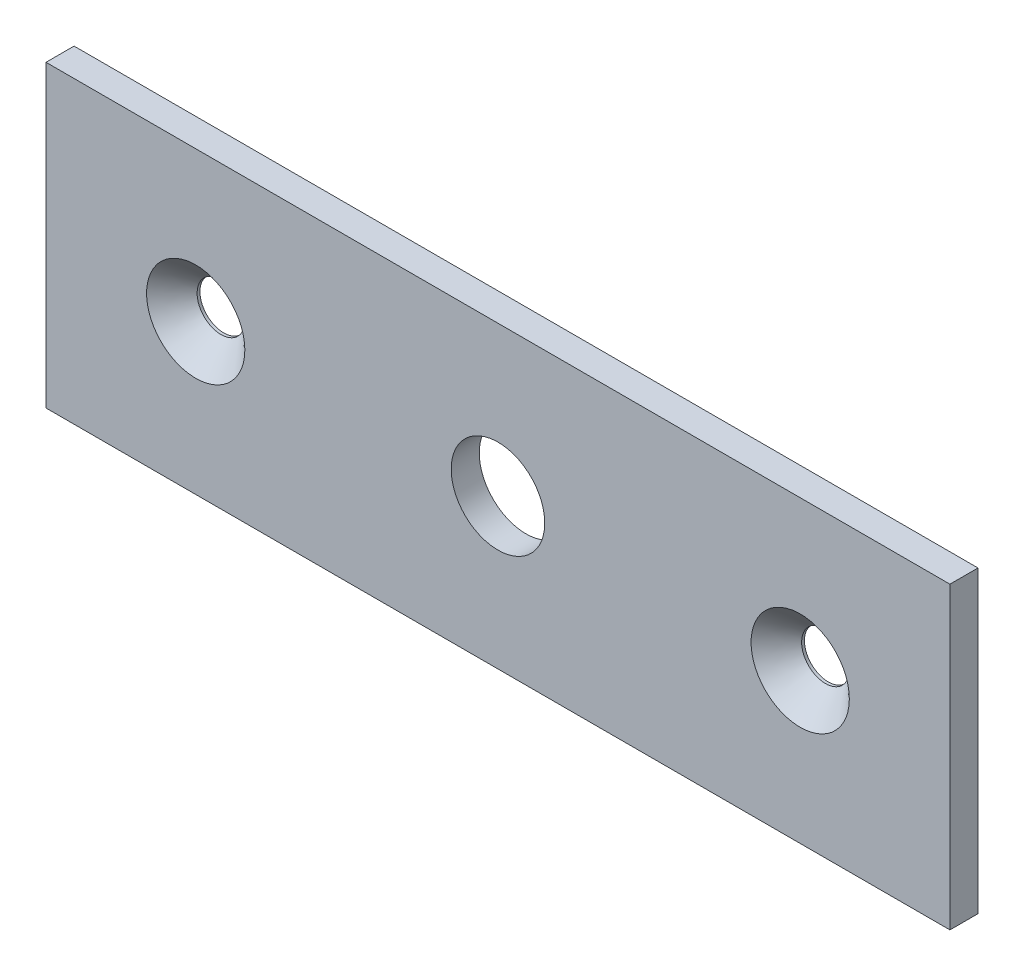
ISO-10303-21;
HEADER;
FILE_DESCRIPTION(('STEP AP214'),'2;1');
FILE_NAME('part.step','',(''),(''),'','','');
FILE_SCHEMA(('AUTOMOTIVE_DESIGN { 1 0 10303 214 1 1 1 1 }'));
ENDSEC;
DATA;
#1=APPLICATION_CONTEXT('core data for automotive mechanical design processes');
#2=APPLICATION_PROTOCOL_DEFINITION('international standard','automotive_design',2000,#1);
#3=PRODUCT_CONTEXT('',#1,'mechanical');
#4=PRODUCT('Part','Part','',(#3));
#5=PRODUCT_RELATED_PRODUCT_CATEGORY('part','',(#4));
#6=PRODUCT_DEFINITION_FORMATION('','',#4);
#7=PRODUCT_DEFINITION_CONTEXT('part definition',#1,'design');
#8=PRODUCT_DEFINITION('design','',#6,#7);
#9=PRODUCT_DEFINITION_SHAPE('','',#8);
#10=(LENGTH_UNIT() NAMED_UNIT(*) SI_UNIT(.MILLI.,.METRE.));
#11=(NAMED_UNIT(*) PLANE_ANGLE_UNIT() SI_UNIT($,.RADIAN.));
#12=(NAMED_UNIT(*) SI_UNIT($,.STERADIAN.) SOLID_ANGLE_UNIT());
#13=UNCERTAINTY_MEASURE_WITH_UNIT(LENGTH_MEASURE(1.E-05),#10,'distance_accuracy_value','');
#14=(GEOMETRIC_REPRESENTATION_CONTEXT(3) GLOBAL_UNCERTAINTY_ASSIGNED_CONTEXT((#13)) GLOBAL_UNIT_ASSIGNED_CONTEXT((#10,
#11,#12)) REPRESENTATION_CONTEXT('',''));
#15=CARTESIAN_POINT('',(0.,0.,0.));
#16=DIRECTION('',(0.,0.,1.));
#17=DIRECTION('',(1.,0.,0.));
#18=AXIS2_PLACEMENT_3D('',#15,#16,#17);
#19=CARTESIAN_POINT('',(-19.8824614450658,16.6713286713287,3.));
#20=DIRECTION('',(1.,0.,0.));
#21=DIRECTION('',(0.,0.,-1.));
#22=AXIS2_PLACEMENT_3D('',#19,#20,#21);
#23=PLANE('',#22);
#24=DIRECTION('',(0.,-1.,0.));
#25=VECTOR('',#24,1.);
#26=CARTESIAN_POINT('',(-19.8824614450658,16.6713286713287,0.));
#27=LINE('',#26,#25);
#28=CARTESIAN_POINT('',(-19.8824614450658,16.6713286713287,0.));
#29=VERTEX_POINT('',#28);
#30=CARTESIAN_POINT('',(-19.8824614450658,-15.3286713286713,0.));
#31=VERTEX_POINT('',#30);
#32=EDGE_CURVE('E102',#29,#31,#27,.T.);
#33=ORIENTED_EDGE('',*,*,#32,.T.);
#34=DIRECTION('',(0.,0.,-1.));
#35=VECTOR('',#34,1.);
#36=CARTESIAN_POINT('',(-19.8824614450658,-15.3286713286713,3.));
#37=LINE('',#36,#35);
#38=CARTESIAN_POINT('',(-19.8824614450658,-15.3286713286713,3.));
#39=VERTEX_POINT('',#38);
#40=EDGE_CURVE('E11',#39,#31,#37,.T.);
#41=ORIENTED_EDGE('',*,*,#40,.F.);
#42=DIRECTION('',(0.,-1.,0.));
#43=VECTOR('',#42,1.);
#44=CARTESIAN_POINT('',(-19.8824614450658,16.6713286713287,3.));
#45=LINE('',#44,#43);
#46=CARTESIAN_POINT('',(-19.8824614450658,16.6713286713287,3.));
#47=VERTEX_POINT('',#46);
#48=EDGE_CURVE('E90',#47,#39,#45,.T.);
#49=ORIENTED_EDGE('',*,*,#48,.F.);
#50=DIRECTION('',(0.,0.,-1.));
#51=VECTOR('',#50,1.);
#52=CARTESIAN_POINT('',(-19.8824614450658,16.6713286713287,3.));
#53=LINE('',#52,#51);
#54=EDGE_CURVE('E98',#47,#29,#53,.T.);
#55=ORIENTED_EDGE('',*,*,#54,.T.);
#56=EDGE_LOOP('',(#33,#41,#49,#55));
#57=FACE_BOUND('',#56,.T.);
#58=ADVANCED_FACE('F39',(#57),#23,.F.);
#59=CARTESIAN_POINT('',(-19.8824614450658,-15.3286713286713,3.));
#60=DIRECTION('',(0.,1.,0.));
#61=DIRECTION('',(-1.,0.,0.));
#62=AXIS2_PLACEMENT_3D('',#59,#60,#61);
#63=PLANE('',#62);
#64=DIRECTION('',(1.,0.,0.));
#65=VECTOR('',#64,1.);
#66=CARTESIAN_POINT('',(-19.8824614450658,-15.3286713286713,0.));
#67=LINE('',#66,#65);
#68=CARTESIAN_POINT('',(76.7175385549342,-15.3286713286713,0.));
#69=VERTEX_POINT('',#68);
#70=EDGE_CURVE('E94',#31,#69,#67,.T.);
#71=ORIENTED_EDGE('',*,*,#70,.T.);
#72=DIRECTION('',(0.,0.,-1.));
#73=VECTOR('',#72,1.);
#74=CARTESIAN_POINT('',(76.7175385549342,-15.3286713286713,3.));
#75=LINE('',#74,#73);
#76=CARTESIAN_POINT('',(76.7175385549342,-15.3286713286713,3.));
#77=VERTEX_POINT('',#76);
#78=EDGE_CURVE('E47',#77,#69,#75,.T.);
#79=ORIENTED_EDGE('',*,*,#78,.F.);
#80=DIRECTION('',(1.,0.,0.));
#81=VECTOR('',#80,1.);
#82=CARTESIAN_POINT('',(-19.8824614450658,-15.3286713286713,3.));
#83=LINE('',#82,#81);
#84=EDGE_CURVE('E85',#39,#77,#83,.T.);
#85=ORIENTED_EDGE('',*,*,#84,.F.);
#86=ORIENTED_EDGE('',*,*,#40,.T.);
#87=EDGE_LOOP('',(#71,#79,#85,#86));
#88=FACE_BOUND('',#87,.T.);
#89=ADVANCED_FACE('F93',(#88),#63,.F.);
#90=CARTESIAN_POINT('',(76.7175385549342,16.6713286713287,3.));
#91=DIRECTION('',(-1.,0.,0.));
#92=DIRECTION('',(0.,0.,1.));
#93=AXIS2_PLACEMENT_3D('',#90,#91,#92);
#94=PLANE('',#93);
#95=DIRECTION('',(0.,1.,0.));
#96=VECTOR('',#95,1.);
#97=CARTESIAN_POINT('',(76.7175385549342,16.6713286713287,0.));
#98=LINE('',#97,#96);
#99=CARTESIAN_POINT('',(76.7175385549342,16.6713286713287,0.));
#100=VERTEX_POINT('',#99);
#101=EDGE_CURVE('E72',#69,#100,#98,.T.);
#102=ORIENTED_EDGE('',*,*,#101,.T.);
#103=DIRECTION('',(0.,0.,-1.));
#104=VECTOR('',#103,1.);
#105=CARTESIAN_POINT('',(76.7175385549342,16.6713286713287,3.));
#106=LINE('',#105,#104);
#107=CARTESIAN_POINT('',(76.7175385549342,16.6713286713287,3.));
#108=VERTEX_POINT('',#107);
#109=EDGE_CURVE('E95',#108,#100,#106,.T.);
#110=ORIENTED_EDGE('',*,*,#109,.F.);
#111=DIRECTION('',(0.,1.,0.));
#112=VECTOR('',#111,1.);
#113=CARTESIAN_POINT('',(76.7175385549342,16.6713286713287,3.));
#114=LINE('',#113,#112);
#115=EDGE_CURVE('E88',#77,#108,#114,.T.);
#116=ORIENTED_EDGE('',*,*,#115,.F.);
#117=ORIENTED_EDGE('',*,*,#78,.T.);
#118=EDGE_LOOP('',(#102,#110,#116,#117));
#119=FACE_BOUND('',#118,.T.);
#120=ADVANCED_FACE('F96',(#119),#94,.F.);
#121=CARTESIAN_POINT('',(-19.8824614450658,16.6713286713287,3.));
#122=DIRECTION('',(0.,-1.,0.));
#123=DIRECTION('',(0.,0.,-1.));
#124=AXIS2_PLACEMENT_3D('',#121,#122,#123);
#125=PLANE('',#124);
#126=DIRECTION('',(-1.,0.,0.));
#127=VECTOR('',#126,1.);
#128=CARTESIAN_POINT('',(-19.8824614450658,16.6713286713287,0.));
#129=LINE('',#128,#127);
#130=EDGE_CURVE('E78',#100,#29,#129,.T.);
#131=ORIENTED_EDGE('',*,*,#130,.T.);
#132=ORIENTED_EDGE('',*,*,#54,.F.);
#133=DIRECTION('',(-1.,0.,0.));
#134=VECTOR('',#133,1.);
#135=CARTESIAN_POINT('',(-19.8824614450658,16.6713286713287,3.));
#136=LINE('',#135,#134);
#137=EDGE_CURVE('E55',#108,#47,#136,.T.);
#138=ORIENTED_EDGE('',*,*,#137,.F.);
#139=ORIENTED_EDGE('',*,*,#109,.T.);
#140=EDGE_LOOP('',(#131,#132,#138,#139));
#141=FACE_BOUND('',#140,.T.);
#142=ADVANCED_FACE('F110',(#141),#125,.F.);
#143=CARTESIAN_POINT('',(0.,0.,3.));
#144=DIRECTION('',(0.,0.,1.));
#145=DIRECTION('',(1.,0.,0.));
#146=AXIS2_PLACEMENT_3D('',#143,#144,#145);
#147=PLANE('',#146);
#148=CARTESIAN_POINT('',(-3.88246144506579,0.671328671328672,3.));
#149=DIRECTION('',(0.,0.,1.));
#150=DIRECTION('',(1.,0.,0.));
#151=AXIS2_PLACEMENT_3D('',#148,#149,#150);
#152=CIRCLE('',#151,5.250000041);
#153=CARTESIAN_POINT('',(1.36753859593421,0.671328671328672,3.));
#154=VERTEX_POINT('',#153);
#155=EDGE_CURVE('E136',#154,#154,#152,.T.);
#156=ORIENTED_EDGE('',*,*,#155,.F.);
#157=EDGE_LOOP('',(#156));
#158=FACE_BOUND('',#157,.T.);
#159=CARTESIAN_POINT('',(60.7175385549342,0.671328671328672,3.));
#160=DIRECTION('',(0.,0.,1.));
#161=DIRECTION('',(1.,0.,0.));
#162=AXIS2_PLACEMENT_3D('',#159,#160,#161);
#163=CIRCLE('',#162,5.250000041);
#164=CARTESIAN_POINT('',(65.9675385959342,0.671328671328672,3.));
#165=VERTEX_POINT('',#164);
#166=EDGE_CURVE('E127',#165,#165,#163,.T.);
#167=ORIENTED_EDGE('',*,*,#166,.F.);
#168=EDGE_LOOP('',(#167));
#169=FACE_BOUND('',#168,.T.);
#170=CARTESIAN_POINT('',(28.4175385549342,0.671328671328673,3.));
#171=DIRECTION('',(0.,0.,1.));
#172=DIRECTION('',(1.,0.,0.));
#173=AXIS2_PLACEMENT_3D('',#170,#171,#172);
#174=CIRCLE('',#173,4.99999999999999);
#175=CARTESIAN_POINT('',(33.4175385549342,0.671328671328673,3.));
#176=VERTEX_POINT('',#175);
#177=EDGE_CURVE('E116',#176,#176,#174,.T.);
#178=ORIENTED_EDGE('',*,*,#177,.F.);
#179=EDGE_LOOP('',(#178));
#180=FACE_BOUND('',#179,.T.);
#181=ORIENTED_EDGE('',*,*,#48,.T.);
#182=ORIENTED_EDGE('',*,*,#84,.T.);
#183=ORIENTED_EDGE('',*,*,#115,.T.);
#184=ORIENTED_EDGE('',*,*,#137,.T.);
#185=EDGE_LOOP('',(#181,#182,#183,#184));
#186=FACE_BOUND('',#185,.T.);
#187=ADVANCED_FACE('F86',(#158,#169,#180,#186),#147,.T.);
#188=CARTESIAN_POINT('',(0.,0.,0.));
#189=DIRECTION('',(0.,0.,1.));
#190=DIRECTION('',(1.,0.,0.));
#191=AXIS2_PLACEMENT_3D('',#188,#189,#190);
#192=PLANE('',#191);
#193=CARTESIAN_POINT('',(-3.88246144506579,0.671328671328672,0.));
#194=DIRECTION('',(0.,0.,1.));
#195=DIRECTION('',(1.,0.,0.));
#196=AXIS2_PLACEMENT_3D('',#193,#194,#195);
#197=CIRCLE('',#196,2.54999998);
#198=CARTESIAN_POINT('',(-1.33246146506579,0.671328671328672,0.));
#199=VERTEX_POINT('',#198);
#200=EDGE_CURVE('E130',#199,#199,#197,.T.);
#201=ORIENTED_EDGE('',*,*,#200,.T.);
#202=EDGE_LOOP('',(#201));
#203=FACE_BOUND('',#202,.T.);
#204=CARTESIAN_POINT('',(60.7175385549342,0.671328671328672,0.));
#205=DIRECTION('',(0.,0.,1.));
#206=DIRECTION('',(1.,0.,0.));
#207=AXIS2_PLACEMENT_3D('',#204,#205,#206);
#208=CIRCLE('',#207,2.54999998);
#209=CARTESIAN_POINT('',(63.2675385349342,0.671328671328672,0.));
#210=VERTEX_POINT('',#209);
#211=EDGE_CURVE('E119',#210,#210,#208,.T.);
#212=ORIENTED_EDGE('',*,*,#211,.T.);
#213=EDGE_LOOP('',(#212));
#214=FACE_BOUND('',#213,.T.);
#215=CARTESIAN_POINT('',(28.4175385549342,0.671328671328673,0.));
#216=DIRECTION('',(0.,0.,1.));
#217=DIRECTION('',(1.,0.,0.));
#218=AXIS2_PLACEMENT_3D('',#215,#216,#217);
#219=CIRCLE('',#218,4.99999999999999);
#220=CARTESIAN_POINT('',(33.4175385549342,0.671328671328673,0.));
#221=VERTEX_POINT('',#220);
#222=EDGE_CURVE('E105',#221,#221,#219,.T.);
#223=ORIENTED_EDGE('',*,*,#222,.T.);
#224=EDGE_LOOP('',(#223));
#225=FACE_BOUND('',#224,.T.);
#226=ORIENTED_EDGE('',*,*,#32,.F.);
#227=ORIENTED_EDGE('',*,*,#130,.F.);
#228=ORIENTED_EDGE('',*,*,#101,.F.);
#229=ORIENTED_EDGE('',*,*,#70,.F.);
#230=EDGE_LOOP('',(#226,#227,#228,#229));
#231=FACE_BOUND('',#230,.T.);
#232=ADVANCED_FACE('F113',(#203,#214,#225,#231),#192,.F.);
#233=CARTESIAN_POINT('',(28.4175385549342,0.671328671328673,0.));
#234=DIRECTION('',(0.,0.,1.));
#235=DIRECTION('',(1.,0.,0.));
#236=AXIS2_PLACEMENT_3D('',#233,#234,#235);
#237=CYLINDRICAL_SURFACE('',#236,4.99999999999999);
#238=ORIENTED_EDGE('',*,*,#222,.F.);
#239=EDGE_LOOP('',(#238));
#240=FACE_BOUND('',#239,.T.);
#241=ORIENTED_EDGE('',*,*,#177,.T.);
#242=EDGE_LOOP('',(#241));
#243=FACE_BOUND('',#242,.T.);
#244=ADVANCED_FACE('F149',(#240,#243),#237,.F.);
#245=CARTESIAN_POINT('',(60.7175385549342,0.671328671328672,3.));
#246=DIRECTION('',(0.,0.,1.));
#247=DIRECTION('',(1.,0.,0.));
#248=AXIS2_PLACEMENT_3D('',#245,#246,#247);
#249=CYLINDRICAL_SURFACE('',#248,2.54999998);
#250=ORIENTED_EDGE('',*,*,#211,.F.);
#251=EDGE_LOOP('',(#250));
#252=FACE_BOUND('',#251,.T.);
#253=CARTESIAN_POINT('',(60.7175385549342,0.671328671328672,0.299999939000002));
#254=DIRECTION('',(0.,0.,1.));
#255=DIRECTION('',(1.,0.,0.));
#256=AXIS2_PLACEMENT_3D('',#253,#254,#255);
#257=CIRCLE('',#256,2.54999998);
#258=CARTESIAN_POINT('',(63.2675385349342,0.671328671328672,0.299999939000002));
#259=VERTEX_POINT('',#258);
#260=EDGE_CURVE('E124',#259,#259,#257,.T.);
#261=ORIENTED_EDGE('',*,*,#260,.T.);
#262=EDGE_LOOP('',(#261));
#263=FACE_BOUND('',#262,.T.);
#264=ADVANCED_FACE('F151',(#252,#263),#249,.F.);
#265=CARTESIAN_POINT('',(60.7175385549342,0.671328671328672,3.));
#266=DIRECTION('',(0.,0.,1.));
#267=DIRECTION('',(1.,0.,0.));
#268=AXIS2_PLACEMENT_3D('',#265,#266,#267);
#269=CONICAL_SURFACE('',#268,5.250000041,0.785398163397449);
#270=ORIENTED_EDGE('',*,*,#260,.F.);
#271=EDGE_LOOP('',(#270));
#272=FACE_BOUND('',#271,.T.);
#273=ORIENTED_EDGE('',*,*,#166,.T.);
#274=EDGE_LOOP('',(#273));
#275=FACE_BOUND('',#274,.T.);
#276=ADVANCED_FACE('F158',(#272,#275),#269,.F.);
#277=CARTESIAN_POINT('',(-3.88246144506579,0.671328671328672,3.));
#278=DIRECTION('',(0.,0.,1.));
#279=DIRECTION('',(1.,0.,0.));
#280=AXIS2_PLACEMENT_3D('',#277,#278,#279);
#281=CYLINDRICAL_SURFACE('',#280,2.54999998);
#282=ORIENTED_EDGE('',*,*,#200,.F.);
#283=EDGE_LOOP('',(#282));
#284=FACE_BOUND('',#283,.T.);
#285=CARTESIAN_POINT('',(-3.88246144506579,0.671328671328672,0.299999939000002));
#286=DIRECTION('',(0.,0.,1.));
#287=DIRECTION('',(1.,0.,0.));
#288=AXIS2_PLACEMENT_3D('',#285,#286,#287);
#289=CIRCLE('',#288,2.54999998);
#290=CARTESIAN_POINT('',(-1.33246146506579,0.671328671328672,0.299999939000002));
#291=VERTEX_POINT('',#290);
#292=EDGE_CURVE('E133',#291,#291,#289,.T.);
#293=ORIENTED_EDGE('',*,*,#292,.T.);
#294=EDGE_LOOP('',(#293));
#295=FACE_BOUND('',#294,.T.);
#296=ADVANCED_FACE('F202',(#284,#295),#281,.F.);
#297=CARTESIAN_POINT('',(-3.88246144506579,0.671328671328672,3.));
#298=DIRECTION('',(0.,0.,1.));
#299=DIRECTION('',(1.,0.,0.));
#300=AXIS2_PLACEMENT_3D('',#297,#298,#299);
#301=CONICAL_SURFACE('',#300,5.250000041,0.785398163397448);
#302=ORIENTED_EDGE('',*,*,#292,.F.);
#303=EDGE_LOOP('',(#302));
#304=FACE_BOUND('',#303,.T.);
#305=ORIENTED_EDGE('',*,*,#155,.T.);
#306=EDGE_LOOP('',(#305));
#307=FACE_BOUND('',#306,.T.);
#308=ADVANCED_FACE('F140',(#304,#307),#301,.F.);
#309=CLOSED_SHELL('',(#58,#89,#120,#142,#187,#232,#244,#264,#276,#296,#308));
#310=MANIFOLD_SOLID_BREP('B2',#309);
#311=ADVANCED_BREP_SHAPE_REPRESENTATION('',(#18,#310),#14);
#312=SHAPE_DEFINITION_REPRESENTATION(#9,#311);
ENDSEC;
END-ISO-10303-21;
